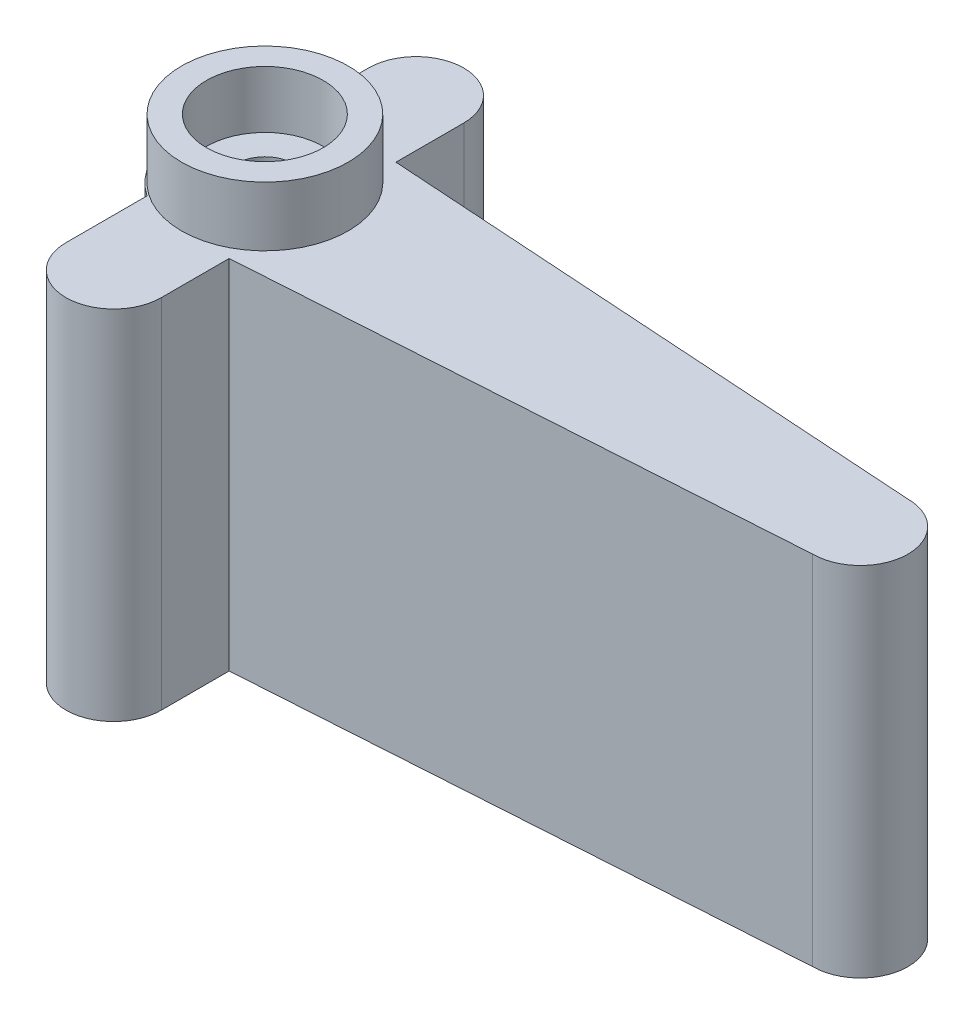
ISO-10303-21;
HEADER;
FILE_DESCRIPTION(('STEP AP214'),'2;1');
FILE_NAME('part.step','',(''),(''),'','','');
FILE_SCHEMA(('AUTOMOTIVE_DESIGN { 1 0 10303 214 1 1 1 1 }'));
ENDSEC;
DATA;
#1=APPLICATION_CONTEXT('core data for automotive mechanical design processes');
#2=APPLICATION_PROTOCOL_DEFINITION('international standard','automotive_design',2000,#1);
#3=PRODUCT_CONTEXT('',#1,'mechanical');
#4=PRODUCT('Part','Part','',(#3));
#5=PRODUCT_RELATED_PRODUCT_CATEGORY('part','',(#4));
#6=PRODUCT_DEFINITION_FORMATION('','',#4);
#7=PRODUCT_DEFINITION_CONTEXT('part definition',#1,'design');
#8=PRODUCT_DEFINITION('design','',#6,#7);
#9=PRODUCT_DEFINITION_SHAPE('','',#8);
#10=(LENGTH_UNIT() NAMED_UNIT(*) SI_UNIT(.MILLI.,.METRE.));
#11=(NAMED_UNIT(*) PLANE_ANGLE_UNIT() SI_UNIT($,.RADIAN.));
#12=(NAMED_UNIT(*) SI_UNIT($,.STERADIAN.) SOLID_ANGLE_UNIT());
#13=UNCERTAINTY_MEASURE_WITH_UNIT(LENGTH_MEASURE(1.E-05),#10,'distance_accuracy_value','');
#14=(GEOMETRIC_REPRESENTATION_CONTEXT(3) GLOBAL_UNCERTAINTY_ASSIGNED_CONTEXT((#13)) GLOBAL_UNIT_ASSIGNED_CONTEXT((#10,
#11,#12)) REPRESENTATION_CONTEXT('',''));
#15=CARTESIAN_POINT('',(0.,0.,0.));
#16=DIRECTION('',(0.,0.,1.));
#17=DIRECTION('',(1.,0.,0.));
#18=AXIS2_PLACEMENT_3D('',#15,#16,#17);
#19=CARTESIAN_POINT('',(0.,15.,0.));
#20=DIRECTION('',(0.,-1.,0.));
#21=DIRECTION('',(0.,0.,-1.));
#22=AXIS2_PLACEMENT_3D('',#19,#20,#21);
#23=CYLINDRICAL_SURFACE('',#22,3.56405667743935);
#24=CARTESIAN_POINT('',(0.,0.,0.));
#25=DIRECTION('',(0.,1.,0.));
#26=DIRECTION('',(0.,0.,1.));
#27=AXIS2_PLACEMENT_3D('',#24,#25,#26);
#28=CIRCLE('',#27,3.56405667743935);
#29=CARTESIAN_POINT('',(-2.,0.,-2.95));
#30=VERTEX_POINT('',#29);
#31=CARTESIAN_POINT('',(-2.,0.,2.95));
#32=VERTEX_POINT('',#31);
#33=EDGE_CURVE('E143',#30,#32,#28,.T.);
#34=ORIENTED_EDGE('',*,*,#33,.T.);
#35=DIRECTION('',(0.,-1.,0.));
#36=VECTOR('',#35,1.);
#37=CARTESIAN_POINT('',(-2.,15.,2.95));
#38=LINE('',#37,#36);
#39=CARTESIAN_POINT('',(-2.,15.,2.95));
#40=VERTEX_POINT('',#39);
#41=EDGE_CURVE('E42',#40,#32,#38,.T.);
#42=ORIENTED_EDGE('',*,*,#41,.F.);
#43=CARTESIAN_POINT('',(0.,15.,0.));
#44=DIRECTION('',(0.,1.,0.));
#45=DIRECTION('',(0.,0.,1.));
#46=AXIS2_PLACEMENT_3D('',#43,#44,#45);
#47=CIRCLE('',#46,3.56405667743935);
#48=CARTESIAN_POINT('',(-2.,15.,-2.95));
#49=VERTEX_POINT('',#48);
#50=EDGE_CURVE('E162',#49,#40,#47,.T.);
#51=ORIENTED_EDGE('',*,*,#50,.F.);
#52=DIRECTION('',(0.,-1.,0.));
#53=VECTOR('',#52,1.);
#54=CARTESIAN_POINT('',(-2.,15.,-2.95));
#55=LINE('',#54,#53);
#56=EDGE_CURVE('E139',#49,#30,#55,.T.);
#57=ORIENTED_EDGE('',*,*,#56,.T.);
#58=EDGE_LOOP('',(#34,#42,#51,#57));
#59=FACE_BOUND('',#58,.T.);
#60=ADVANCED_FACE('F34',(#59),#23,.T.);
#61=CARTESIAN_POINT('',(-2.,15.,6.34999999999999));
#62=DIRECTION('',(1.,0.,0.));
#63=DIRECTION('',(0.,0.,-1.));
#64=AXIS2_PLACEMENT_3D('',#61,#62,#63);
#65=PLANE('',#64);
#66=DIRECTION('',(0.,0.,1.));
#67=VECTOR('',#66,1.);
#68=CARTESIAN_POINT('',(-2.,0.,6.34999999999999));
#69=LINE('',#68,#67);
#70=CARTESIAN_POINT('',(-2.00000000000001,0.,6.34999999999999));
#71=VERTEX_POINT('',#70);
#72=EDGE_CURVE('E146',#32,#71,#69,.T.);
#73=ORIENTED_EDGE('',*,*,#72,.T.);
#74=DIRECTION('',(0.,-1.,0.));
#75=VECTOR('',#74,1.);
#76=CARTESIAN_POINT('',(-2.00000000000001,15.,6.34999999999999));
#77=LINE('',#76,#75);
#78=CARTESIAN_POINT('',(-2.00000000000001,15.,6.34999999999999));
#79=VERTEX_POINT('',#78);
#80=EDGE_CURVE('E178',#79,#71,#77,.T.);
#81=ORIENTED_EDGE('',*,*,#80,.F.);
#82=DIRECTION('',(0.,0.,1.));
#83=VECTOR('',#82,1.);
#84=CARTESIAN_POINT('',(-2.,15.,6.34999999999999));
#85=LINE('',#84,#83);
#86=EDGE_CURVE('E100',#40,#79,#85,.T.);
#87=ORIENTED_EDGE('',*,*,#86,.F.);
#88=ORIENTED_EDGE('',*,*,#41,.T.);
#89=EDGE_LOOP('',(#73,#81,#87,#88));
#90=FACE_BOUND('',#89,.T.);
#91=ADVANCED_FACE('F243',(#90),#65,.F.);
#92=CARTESIAN_POINT('',(0.,15.,6.34999999999999));
#93=DIRECTION('',(0.,-1.,0.));
#94=DIRECTION('',(0.,0.,-1.));
#95=AXIS2_PLACEMENT_3D('',#92,#93,#94);
#96=CYLINDRICAL_SURFACE('',#95,1.99999999999999);
#97=CARTESIAN_POINT('',(0.,0.,6.34999999999999));
#98=DIRECTION('',(0.,1.,0.));
#99=DIRECTION('',(0.,0.,-1.));
#100=AXIS2_PLACEMENT_3D('',#97,#98,#99);
#101=CIRCLE('',#100,1.99999999999999);
#102=CARTESIAN_POINT('',(1.99999999999999,0.,6.34999999999999));
#103=VERTEX_POINT('',#102);
#104=EDGE_CURVE('E149',#71,#103,#101,.T.);
#105=ORIENTED_EDGE('',*,*,#104,.T.);
#106=DIRECTION('',(0.,-1.,0.));
#107=VECTOR('',#106,1.);
#108=CARTESIAN_POINT('',(1.99999999999999,15.,6.34999999999999));
#109=LINE('',#108,#107);
#110=CARTESIAN_POINT('',(1.99999999999999,15.,6.34999999999999));
#111=VERTEX_POINT('',#110);
#112=EDGE_CURVE('E175',#111,#103,#109,.T.);
#113=ORIENTED_EDGE('',*,*,#112,.F.);
#114=CARTESIAN_POINT('',(0.,15.,6.34999999999999));
#115=DIRECTION('',(0.,1.,0.));
#116=DIRECTION('',(0.,0.,-1.));
#117=AXIS2_PLACEMENT_3D('',#114,#115,#116);
#118=CIRCLE('',#117,1.99999999999999);
#119=EDGE_CURVE('E207',#79,#111,#118,.T.);
#120=ORIENTED_EDGE('',*,*,#119,.F.);
#121=ORIENTED_EDGE('',*,*,#80,.T.);
#122=EDGE_LOOP('',(#105,#113,#120,#121));
#123=FACE_BOUND('',#122,.T.);
#124=ADVANCED_FACE('F247',(#123),#96,.T.);
#125=CARTESIAN_POINT('',(1.99999999999999,15.,6.34999999999999));
#126=DIRECTION('',(-1.,0.,0.));
#127=DIRECTION('',(0.,0.,1.));
#128=AXIS2_PLACEMENT_3D('',#125,#126,#127);
#129=PLANE('',#128);
#130=DIRECTION('',(0.,0.,-1.));
#131=VECTOR('',#130,1.);
#132=CARTESIAN_POINT('',(1.99999999999999,0.,6.34999999999999));
#133=LINE('',#132,#131);
#134=CARTESIAN_POINT('',(2.,0.,3.5));
#135=VERTEX_POINT('',#134);
#136=EDGE_CURVE('E151',#103,#135,#133,.T.);
#137=ORIENTED_EDGE('',*,*,#136,.T.);
#138=DIRECTION('',(0.,-1.,0.));
#139=VECTOR('',#138,1.);
#140=CARTESIAN_POINT('',(2.,15.,3.5));
#141=LINE('',#140,#139);
#142=CARTESIAN_POINT('',(2.,15.,3.5));
#143=VERTEX_POINT('',#142);
#144=EDGE_CURVE('E172',#143,#135,#141,.T.);
#145=ORIENTED_EDGE('',*,*,#144,.F.);
#146=DIRECTION('',(0.,0.,-1.));
#147=VECTOR('',#146,1.);
#148=CARTESIAN_POINT('',(1.99999999999999,15.,6.34999999999999));
#149=LINE('',#148,#147);
#150=EDGE_CURVE('E209',#111,#143,#149,.T.);
#151=ORIENTED_EDGE('',*,*,#150,.F.);
#152=ORIENTED_EDGE('',*,*,#112,.T.);
#153=EDGE_LOOP('',(#137,#145,#151,#152));
#154=FACE_BOUND('',#153,.T.);
#155=ADVANCED_FACE('F251',(#154),#129,.F.);
#156=CARTESIAN_POINT('',(25.,15.,1.99999999999999));
#157=DIRECTION('',(-0.0650791373455972,0.,-0.997880105965818));
#158=DIRECTION('',(-0.997880105965819,0.,0.0650791373455972));
#159=AXIS2_PLACEMENT_3D('',#156,#157,#158);
#160=PLANE('',#159);
#161=DIRECTION('',(0.997880105965818,0.,-0.0650791373455972));
#162=VECTOR('',#161,1.);
#163=CARTESIAN_POINT('',(25.,0.,1.99999999999999));
#164=LINE('',#163,#162);
#165=CARTESIAN_POINT('',(25.,0.,1.99999999999999));
#166=VERTEX_POINT('',#165);
#167=EDGE_CURVE('E153',#135,#166,#164,.T.);
#168=ORIENTED_EDGE('',*,*,#167,.T.);
#169=DIRECTION('',(0.,-1.,0.));
#170=VECTOR('',#169,1.);
#171=CARTESIAN_POINT('',(25.,15.,1.99999999999999));
#172=LINE('',#171,#170);
#173=CARTESIAN_POINT('',(25.,15.,1.99999999999999));
#174=VERTEX_POINT('',#173);
#175=EDGE_CURVE('E169',#174,#166,#172,.T.);
#176=ORIENTED_EDGE('',*,*,#175,.F.);
#177=DIRECTION('',(0.997880105965818,0.,-0.0650791373455972));
#178=VECTOR('',#177,1.);
#179=CARTESIAN_POINT('',(25.,15.,1.99999999999999));
#180=LINE('',#179,#178);
#181=EDGE_CURVE('E211',#143,#174,#180,.T.);
#182=ORIENTED_EDGE('',*,*,#181,.F.);
#183=ORIENTED_EDGE('',*,*,#144,.T.);
#184=EDGE_LOOP('',(#168,#176,#182,#183));
#185=FACE_BOUND('',#184,.T.);
#186=ADVANCED_FACE('F257',(#185),#160,.F.);
#187=CARTESIAN_POINT('',(25.,15.,0.));
#188=DIRECTION('',(0.,-1.,0.));
#189=DIRECTION('',(0.,0.,-1.));
#190=AXIS2_PLACEMENT_3D('',#187,#188,#189);
#191=CYLINDRICAL_SURFACE('',#190,2.);
#192=CARTESIAN_POINT('',(25.,0.,0.));
#193=DIRECTION('',(0.,1.,0.));
#194=DIRECTION('',(0.,0.,-1.));
#195=AXIS2_PLACEMENT_3D('',#192,#193,#194);
#196=CIRCLE('',#195,2.);
#197=CARTESIAN_POINT('',(25.,0.,-2.00000000000001));
#198=VERTEX_POINT('',#197);
#199=EDGE_CURVE('E155',#166,#198,#196,.T.);
#200=ORIENTED_EDGE('',*,*,#199,.T.);
#201=DIRECTION('',(0.,-1.,0.));
#202=VECTOR('',#201,1.);
#203=CARTESIAN_POINT('',(25.,15.,-2.00000000000001));
#204=LINE('',#203,#202);
#205=CARTESIAN_POINT('',(25.,15.,-2.00000000000001));
#206=VERTEX_POINT('',#205);
#207=EDGE_CURVE('E166',#206,#198,#204,.T.);
#208=ORIENTED_EDGE('',*,*,#207,.F.);
#209=CARTESIAN_POINT('',(25.,15.,0.));
#210=DIRECTION('',(0.,1.,0.));
#211=DIRECTION('',(0.,0.,-1.));
#212=AXIS2_PLACEMENT_3D('',#209,#210,#211);
#213=CIRCLE('',#212,2.);
#214=EDGE_CURVE('E213',#174,#206,#213,.T.);
#215=ORIENTED_EDGE('',*,*,#214,.F.);
#216=ORIENTED_EDGE('',*,*,#175,.T.);
#217=EDGE_LOOP('',(#200,#208,#215,#216));
#218=FACE_BOUND('',#217,.T.);
#219=ADVANCED_FACE('F219',(#218),#191,.T.);
#220=CARTESIAN_POINT('',(25.,15.,-2.00000000000001));
#221=DIRECTION('',(-0.0650791373455966,0.,0.997880105965818));
#222=DIRECTION('',(0.997880105965819,0.,0.0650791373455966));
#223=AXIS2_PLACEMENT_3D('',#220,#221,#222);
#224=PLANE('',#223);
#225=DIRECTION('',(-0.997880105965818,0.,-0.0650791373455966));
#226=VECTOR('',#225,1.);
#227=CARTESIAN_POINT('',(25.,0.,-2.00000000000001));
#228=LINE('',#227,#226);
#229=CARTESIAN_POINT('',(2.,0.,-3.5));
#230=VERTEX_POINT('',#229);
#231=EDGE_CURVE('E157',#198,#230,#228,.T.);
#232=ORIENTED_EDGE('',*,*,#231,.T.);
#233=DIRECTION('',(0.,-1.,0.));
#234=VECTOR('',#233,1.);
#235=CARTESIAN_POINT('',(2.,15.,-3.5));
#236=LINE('',#235,#234);
#237=CARTESIAN_POINT('',(2.,15.,-3.5));
#238=VERTEX_POINT('',#237);
#239=EDGE_CURVE('E134',#238,#230,#236,.T.);
#240=ORIENTED_EDGE('',*,*,#239,.F.);
#241=DIRECTION('',(-0.997880105965818,0.,-0.0650791373455966));
#242=VECTOR('',#241,1.);
#243=CARTESIAN_POINT('',(25.,15.,-2.00000000000001));
#244=LINE('',#243,#242);
#245=EDGE_CURVE('E125',#206,#238,#244,.T.);
#246=ORIENTED_EDGE('',*,*,#245,.F.);
#247=ORIENTED_EDGE('',*,*,#207,.T.);
#248=EDGE_LOOP('',(#232,#240,#246,#247));
#249=FACE_BOUND('',#248,.T.);
#250=ADVANCED_FACE('F223',(#249),#224,.F.);
#251=CARTESIAN_POINT('',(2.,15.,-6.35));
#252=DIRECTION('',(-1.,0.,0.));
#253=DIRECTION('',(0.,0.,1.));
#254=AXIS2_PLACEMENT_3D('',#251,#252,#253);
#255=PLANE('',#254);
#256=DIRECTION('',(0.,0.,-1.));
#257=VECTOR('',#256,1.);
#258=CARTESIAN_POINT('',(2.,0.,-6.35));
#259=LINE('',#258,#257);
#260=CARTESIAN_POINT('',(2.,0.,-6.35));
#261=VERTEX_POINT('',#260);
#262=EDGE_CURVE('E133',#230,#261,#259,.T.);
#263=ORIENTED_EDGE('',*,*,#262,.T.);
#264=DIRECTION('',(0.,-1.,0.));
#265=VECTOR('',#264,1.);
#266=CARTESIAN_POINT('',(2.,15.,-6.35));
#267=LINE('',#266,#265);
#268=CARTESIAN_POINT('',(2.,15.,-6.35));
#269=VERTEX_POINT('',#268);
#270=EDGE_CURVE('E130',#269,#261,#267,.T.);
#271=ORIENTED_EDGE('',*,*,#270,.F.);
#272=DIRECTION('',(0.,0.,-1.));
#273=VECTOR('',#272,1.);
#274=CARTESIAN_POINT('',(2.,15.,-6.35));
#275=LINE('',#274,#273);
#276=EDGE_CURVE('E119',#238,#269,#275,.T.);
#277=ORIENTED_EDGE('',*,*,#276,.F.);
#278=ORIENTED_EDGE('',*,*,#239,.T.);
#279=EDGE_LOOP('',(#263,#271,#277,#278));
#280=FACE_BOUND('',#279,.T.);
#281=ADVANCED_FACE('F131',(#280),#255,.F.);
#282=CARTESIAN_POINT('',(0.,15.,-6.35));
#283=DIRECTION('',(0.,-1.,0.));
#284=DIRECTION('',(0.,0.,-1.));
#285=AXIS2_PLACEMENT_3D('',#282,#283,#284);
#286=CYLINDRICAL_SURFACE('',#285,2.);
#287=CARTESIAN_POINT('',(0.,0.,-6.35));
#288=DIRECTION('',(0.,1.,0.));
#289=DIRECTION('',(0.,0.,1.));
#290=AXIS2_PLACEMENT_3D('',#287,#288,#289);
#291=CIRCLE('',#290,2.);
#292=CARTESIAN_POINT('',(-2.,0.,-6.35));
#293=VERTEX_POINT('',#292);
#294=EDGE_CURVE('E85',#261,#293,#291,.T.);
#295=ORIENTED_EDGE('',*,*,#294,.T.);
#296=DIRECTION('',(0.,-1.,0.));
#297=VECTOR('',#296,1.);
#298=CARTESIAN_POINT('',(-2.,15.,-6.35));
#299=LINE('',#298,#297);
#300=CARTESIAN_POINT('',(-2.,15.,-6.35));
#301=VERTEX_POINT('',#300);
#302=EDGE_CURVE('E135',#301,#293,#299,.T.);
#303=ORIENTED_EDGE('',*,*,#302,.F.);
#304=CARTESIAN_POINT('',(0.,15.,-6.35));
#305=DIRECTION('',(0.,1.,0.));
#306=DIRECTION('',(0.,0.,1.));
#307=AXIS2_PLACEMENT_3D('',#304,#305,#306);
#308=CIRCLE('',#307,2.);
#309=EDGE_CURVE('E123',#269,#301,#308,.T.);
#310=ORIENTED_EDGE('',*,*,#309,.F.);
#311=ORIENTED_EDGE('',*,*,#270,.T.);
#312=EDGE_LOOP('',(#295,#303,#310,#311));
#313=FACE_BOUND('',#312,.T.);
#314=ADVANCED_FACE('F137',(#313),#286,.T.);
#315=CARTESIAN_POINT('',(-2.,15.,-6.35));
#316=DIRECTION('',(1.,0.,0.));
#317=DIRECTION('',(0.,0.,-1.));
#318=AXIS2_PLACEMENT_3D('',#315,#316,#317);
#319=PLANE('',#318);
#320=DIRECTION('',(0.,0.,1.));
#321=VECTOR('',#320,1.);
#322=CARTESIAN_POINT('',(-2.,0.,-6.35));
#323=LINE('',#322,#321);
#324=EDGE_CURVE('E91',#293,#30,#323,.T.);
#325=ORIENTED_EDGE('',*,*,#324,.T.);
#326=ORIENTED_EDGE('',*,*,#56,.F.);
#327=DIRECTION('',(0.,0.,1.));
#328=VECTOR('',#327,1.);
#329=CARTESIAN_POINT('',(-2.,15.,-6.35));
#330=LINE('',#329,#328);
#331=EDGE_CURVE('E50',#301,#49,#330,.T.);
#332=ORIENTED_EDGE('',*,*,#331,.F.);
#333=ORIENTED_EDGE('',*,*,#302,.T.);
#334=EDGE_LOOP('',(#325,#326,#332,#333));
#335=FACE_BOUND('',#334,.T.);
#336=ADVANCED_FACE('F231',(#335),#319,.F.);
#337=CARTESIAN_POINT('',(0.,15.,0.));
#338=DIRECTION('',(0.,1.,0.));
#339=DIRECTION('',(0.,0.,1.));
#340=AXIS2_PLACEMENT_3D('',#337,#338,#339);
#341=PLANE('',#340);
#342=CARTESIAN_POINT('',(0.,15.,0.));
#343=DIRECTION('',(0.,1.,0.));
#344=DIRECTION('',(0.,0.,1.));
#345=AXIS2_PLACEMENT_3D('',#342,#343,#344);
#346=CIRCLE('',#345,3.5);
#347=CARTESIAN_POINT('',(0.,15.,3.5));
#348=VERTEX_POINT('',#347);
#349=EDGE_CURVE('E188',#348,#348,#346,.T.);
#350=ORIENTED_EDGE('',*,*,#349,.F.);
#351=EDGE_LOOP('',(#350));
#352=FACE_BOUND('',#351,.T.);
#353=ORIENTED_EDGE('',*,*,#50,.T.);
#354=ORIENTED_EDGE('',*,*,#86,.T.);
#355=ORIENTED_EDGE('',*,*,#119,.T.);
#356=ORIENTED_EDGE('',*,*,#150,.T.);
#357=ORIENTED_EDGE('',*,*,#181,.T.);
#358=ORIENTED_EDGE('',*,*,#214,.T.);
#359=ORIENTED_EDGE('',*,*,#245,.T.);
#360=ORIENTED_EDGE('',*,*,#276,.T.);
#361=ORIENTED_EDGE('',*,*,#309,.T.);
#362=ORIENTED_EDGE('',*,*,#331,.T.);
#363=EDGE_LOOP('',(#353,#354,#355,#356,#357,#358,#359,#360,#361,#362));
#364=FACE_BOUND('',#363,.T.);
#365=ADVANCED_FACE('F121',(#352,#364),#341,.T.);
#366=CARTESIAN_POINT('',(0.,0.,0.));
#367=DIRECTION('',(0.,1.,0.));
#368=DIRECTION('',(0.,0.,1.));
#369=AXIS2_PLACEMENT_3D('',#366,#367,#368);
#370=PLANE('',#369);
#371=CARTESIAN_POINT('',(0.,0.,0.));
#372=DIRECTION('',(0.,-1.,0.));
#373=DIRECTION('',(0.,0.,-1.));
#374=AXIS2_PLACEMENT_3D('',#371,#372,#373);
#375=CIRCLE('',#374,2.35);
#376=CARTESIAN_POINT('',(0.,0.,-2.35));
#377=VERTEX_POINT('',#376);
#378=EDGE_CURVE('E198',#377,#377,#375,.T.);
#379=ORIENTED_EDGE('',*,*,#378,.F.);
#380=EDGE_LOOP('',(#379));
#381=FACE_BOUND('',#380,.T.);
#382=ORIENTED_EDGE('',*,*,#33,.F.);
#383=ORIENTED_EDGE('',*,*,#324,.F.);
#384=ORIENTED_EDGE('',*,*,#294,.F.);
#385=ORIENTED_EDGE('',*,*,#262,.F.);
#386=ORIENTED_EDGE('',*,*,#231,.F.);
#387=ORIENTED_EDGE('',*,*,#199,.F.);
#388=ORIENTED_EDGE('',*,*,#167,.F.);
#389=ORIENTED_EDGE('',*,*,#136,.F.);
#390=ORIENTED_EDGE('',*,*,#104,.F.);
#391=ORIENTED_EDGE('',*,*,#72,.F.);
#392=EDGE_LOOP('',(#382,#383,#384,#385,#386,#387,#388,#389,#390,#391));
#393=FACE_BOUND('',#392,.T.);
#394=ADVANCED_FACE('F226',(#381,#393),#370,.F.);
#395=CARTESIAN_POINT('',(0.,1.,0.));
#396=DIRECTION('',(0.,-1.,0.));
#397=DIRECTION('',(0.,0.,-1.));
#398=AXIS2_PLACEMENT_3D('',#395,#396,#397);
#399=CYLINDRICAL_SURFACE('',#398,2.35);
#400=CARTESIAN_POINT('',(0.,1.,0.));
#401=DIRECTION('',(0.,-1.,0.));
#402=DIRECTION('',(0.,0.,-1.));
#403=AXIS2_PLACEMENT_3D('',#400,#401,#402);
#404=CIRCLE('',#403,2.35);
#405=CARTESIAN_POINT('',(0.,1.,-2.35));
#406=VERTEX_POINT('',#405);
#407=EDGE_CURVE('E147',#406,#406,#404,.T.);
#408=ORIENTED_EDGE('',*,*,#407,.F.);
#409=EDGE_LOOP('',(#408));
#410=FACE_BOUND('',#409,.T.);
#411=ORIENTED_EDGE('',*,*,#378,.T.);
#412=EDGE_LOOP('',(#411));
#413=FACE_BOUND('',#412,.T.);
#414=ADVANCED_FACE('F289',(#410,#413),#399,.F.);
#415=CARTESIAN_POINT('',(0.,1.,0.));
#416=DIRECTION('',(0.,-1.,0.));
#417=DIRECTION('',(0.,0.,-1.));
#418=AXIS2_PLACEMENT_3D('',#415,#416,#417);
#419=PLANE('',#418);
#420=CARTESIAN_POINT('',(0.,1.,0.));
#421=DIRECTION('',(0.,-1.,0.));
#422=DIRECTION('',(0.,0.,-1.));
#423=AXIS2_PLACEMENT_3D('',#420,#421,#422);
#424=CIRCLE('',#423,1.2);
#425=CARTESIAN_POINT('',(0.,1.,-1.2));
#426=VERTEX_POINT('',#425);
#427=EDGE_CURVE('E181',#426,#426,#424,.T.);
#428=ORIENTED_EDGE('',*,*,#427,.F.);
#429=EDGE_LOOP('',(#428));
#430=FACE_BOUND('',#429,.T.);
#431=ORIENTED_EDGE('',*,*,#407,.T.);
#432=EDGE_LOOP('',(#431));
#433=FACE_BOUND('',#432,.T.);
#434=ADVANCED_FACE('F298',(#430,#433),#419,.T.);
#435=CARTESIAN_POINT('',(0.,17.5,0.));
#436=DIRECTION('',(0.,1.,0.));
#437=DIRECTION('',(0.,0.,1.));
#438=AXIS2_PLACEMENT_3D('',#435,#436,#437);
#439=PLANE('',#438);
#440=CARTESIAN_POINT('',(0.,17.5,0.));
#441=DIRECTION('',(0.,1.,0.));
#442=DIRECTION('',(0.,0.,1.));
#443=AXIS2_PLACEMENT_3D('',#440,#441,#442);
#444=CIRCLE('',#443,3.5);
#445=CARTESIAN_POINT('',(0.,17.5,3.5));
#446=VERTEX_POINT('',#445);
#447=EDGE_CURVE('E195',#446,#446,#444,.T.);
#448=ORIENTED_EDGE('',*,*,#447,.T.);
#449=EDGE_LOOP('',(#448));
#450=FACE_BOUND('',#449,.T.);
#451=CARTESIAN_POINT('',(0.,17.5,0.));
#452=DIRECTION('',(0.,1.,0.));
#453=DIRECTION('',(0.,0.,1.));
#454=AXIS2_PLACEMENT_3D('',#451,#452,#453);
#455=CIRCLE('',#454,2.45);
#456=CARTESIAN_POINT('',(0.,17.5,2.45));
#457=VERTEX_POINT('',#456);
#458=EDGE_CURVE('E183',#457,#457,#455,.T.);
#459=ORIENTED_EDGE('',*,*,#458,.F.);
#460=EDGE_LOOP('',(#459));
#461=FACE_BOUND('',#460,.T.);
#462=ADVANCED_FACE('F311',(#450,#461),#439,.T.);
#463=CARTESIAN_POINT('',(0.,17.5,0.));
#464=DIRECTION('',(0.,-1.,0.));
#465=DIRECTION('',(0.,0.,-1.));
#466=AXIS2_PLACEMENT_3D('',#463,#464,#465);
#467=CYLINDRICAL_SURFACE('',#466,3.5);
#468=ORIENTED_EDGE('',*,*,#447,.F.);
#469=EDGE_LOOP('',(#468));
#470=FACE_BOUND('',#469,.T.);
#471=ORIENTED_EDGE('',*,*,#349,.T.);
#472=EDGE_LOOP('',(#471));
#473=FACE_BOUND('',#472,.T.);
#474=ADVANCED_FACE('F316',(#470,#473),#467,.T.);
#475=CARTESIAN_POINT('',(0.,17.5,0.));
#476=DIRECTION('',(0.,-1.,0.));
#477=DIRECTION('',(0.,0.,-1.));
#478=AXIS2_PLACEMENT_3D('',#475,#476,#477);
#479=CYLINDRICAL_SURFACE('',#478,2.45);
#480=CARTESIAN_POINT('',(0.,15.1,0.));
#481=DIRECTION('',(0.,1.,0.));
#482=DIRECTION('',(0.,0.,1.));
#483=AXIS2_PLACEMENT_3D('',#480,#481,#482);
#484=CIRCLE('',#483,2.45);
#485=CARTESIAN_POINT('',(0.,15.1,2.45));
#486=VERTEX_POINT('',#485);
#487=EDGE_CURVE('E11',#486,#486,#484,.T.);
#488=ORIENTED_EDGE('',*,*,#487,.F.);
#489=EDGE_LOOP('',(#488));
#490=FACE_BOUND('',#489,.T.);
#491=ORIENTED_EDGE('',*,*,#458,.T.);
#492=EDGE_LOOP('',(#491));
#493=FACE_BOUND('',#492,.T.);
#494=ADVANCED_FACE('F326',(#490,#493),#479,.F.);
#495=CARTESIAN_POINT('',(0.,0.,0.));
#496=DIRECTION('',(0.,1.,0.));
#497=DIRECTION('',(0.,0.,1.));
#498=AXIS2_PLACEMENT_3D('',#495,#496,#497);
#499=CYLINDRICAL_SURFACE('',#498,1.2);
#500=ORIENTED_EDGE('',*,*,#427,.T.);
#501=EDGE_LOOP('',(#500));
#502=FACE_BOUND('',#501,.T.);
#503=CARTESIAN_POINT('',(0.,15.1,0.));
#504=DIRECTION('',(0.,1.,0.));
#505=DIRECTION('',(0.,0.,1.));
#506=AXIS2_PLACEMENT_3D('',#503,#504,#505);
#507=CIRCLE('',#506,1.2);
#508=CARTESIAN_POINT('',(0.,15.1,1.2));
#509=VERTEX_POINT('',#508);
#510=EDGE_CURVE('E184',#509,#509,#507,.T.);
#511=ORIENTED_EDGE('',*,*,#510,.T.);
#512=EDGE_LOOP('',(#511));
#513=FACE_BOUND('',#512,.T.);
#514=ADVANCED_FACE('F343',(#502,#513),#499,.F.);
#515=CARTESIAN_POINT('',(0.,15.1,0.));
#516=DIRECTION('',(0.,1.,0.));
#517=DIRECTION('',(0.,0.,1.));
#518=AXIS2_PLACEMENT_3D('',#515,#516,#517);
#519=PLANE('',#518);
#520=ORIENTED_EDGE('',*,*,#487,.T.);
#521=EDGE_LOOP('',(#520));
#522=FACE_BOUND('',#521,.T.);
#523=ORIENTED_EDGE('',*,*,#510,.F.);
#524=EDGE_LOOP('',(#523));
#525=FACE_BOUND('',#524,.T.);
#526=ADVANCED_FACE('F354',(#522,#525),#519,.T.);
#527=CLOSED_SHELL('',(#60,#91,#124,#155,#186,#219,#250,#281,#314,#336,#365,#394,#414,#434,#462,
#474,#494,#514,#526));
#528=MANIFOLD_SOLID_BREP('B2',#527);
#529=ADVANCED_BREP_SHAPE_REPRESENTATION('',(#18,#528),#14);
#530=SHAPE_DEFINITION_REPRESENTATION(#9,#529);
ENDSEC;
END-ISO-10303-21;
